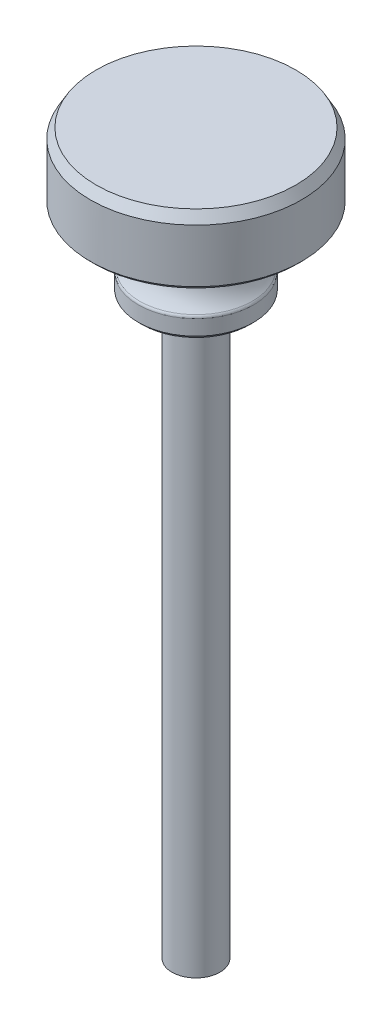
ISO-10303-21;
HEADER;
FILE_DESCRIPTION(('STEP AP214'),'2;1');
FILE_NAME('part.step','',(''),(''),'','','');
FILE_SCHEMA(('AUTOMOTIVE_DESIGN { 1 0 10303 214 1 1 1 1 }'));
ENDSEC;
DATA;
#1=APPLICATION_CONTEXT('core data for automotive mechanical design processes');
#2=APPLICATION_PROTOCOL_DEFINITION('international standard','automotive_design',2000,#1);
#3=PRODUCT_CONTEXT('',#1,'mechanical');
#4=PRODUCT('Part','Part','',(#3));
#5=PRODUCT_RELATED_PRODUCT_CATEGORY('part','',(#4));
#6=PRODUCT_DEFINITION_FORMATION('','',#4);
#7=PRODUCT_DEFINITION_CONTEXT('part definition',#1,'design');
#8=PRODUCT_DEFINITION('design','',#6,#7);
#9=PRODUCT_DEFINITION_SHAPE('','',#8);
#10=(LENGTH_UNIT() NAMED_UNIT(*) SI_UNIT(.MILLI.,.METRE.));
#11=(NAMED_UNIT(*) PLANE_ANGLE_UNIT() SI_UNIT($,.RADIAN.));
#12=(NAMED_UNIT(*) SI_UNIT($,.STERADIAN.) SOLID_ANGLE_UNIT());
#13=UNCERTAINTY_MEASURE_WITH_UNIT(LENGTH_MEASURE(1.E-05),#10,'distance_accuracy_value','');
#14=(GEOMETRIC_REPRESENTATION_CONTEXT(3) GLOBAL_UNCERTAINTY_ASSIGNED_CONTEXT((#13)) GLOBAL_UNIT_ASSIGNED_CONTEXT((#10,
#11,#12)) REPRESENTATION_CONTEXT('',''));
#15=CARTESIAN_POINT('',(0.,0.,0.));
#16=DIRECTION('',(0.,0.,1.));
#17=DIRECTION('',(1.,0.,0.));
#18=AXIS2_PLACEMENT_3D('',#15,#16,#17);
#19=CARTESIAN_POINT('',(0.,68.916509816989,0.));
#20=DIRECTION('',(0.,-1.,0.));
#21=DIRECTION('',(0.,0.,-1.));
#22=AXIS2_PLACEMENT_3D('',#19,#20,#21);
#23=PLANE('',#22);
#24=CARTESIAN_POINT('',(0.,68.916509816989,0.));
#25=DIRECTION('',(0.,-1.,0.));
#26=DIRECTION('',(0.,0.,-1.));
#27=AXIS2_PLACEMENT_3D('',#24,#25,#26);
#28=CIRCLE('',#27,1.25);
#29=CARTESIAN_POINT('',(0.,68.916509816989,-1.25));
#30=VERTEX_POINT('',#29);
#31=EDGE_CURVE('E81',#30,#30,#28,.T.);
#32=ORIENTED_EDGE('',*,*,#31,.T.);
#33=EDGE_LOOP('',(#32));
#34=FACE_BOUND('',#33,.T.);
#35=ADVANCED_FACE('F46',(#34),#23,.T.);
#36=CARTESIAN_POINT('',(0.,88.7878888527258,0.));
#37=DIRECTION('',(0.,-1.,0.));
#38=DIRECTION('',(0.,0.,-1.));
#39=AXIS2_PLACEMENT_3D('',#36,#37,#38);
#40=CYLINDRICAL_SURFACE('',#39,1.25);
#41=CARTESIAN_POINT('',(0.,98.916509816989,0.));
#42=DIRECTION('',(0.,-1.,0.));
#43=DIRECTION('',(0.,0.,-1.));
#44=AXIS2_PLACEMENT_3D('',#41,#42,#43);
#45=CIRCLE('',#44,1.25);
#46=CARTESIAN_POINT('',(0.,98.916509816989,-1.25));
#47=VERTEX_POINT('',#46);
#48=EDGE_CURVE('E87',#47,#47,#45,.T.);
#49=ORIENTED_EDGE('',*,*,#48,.T.);
#50=EDGE_LOOP('',(#49));
#51=FACE_BOUND('',#50,.T.);
#52=ORIENTED_EDGE('',*,*,#31,.F.);
#53=EDGE_LOOP('',(#52));
#54=FACE_BOUND('',#53,.T.);
#55=ADVANCED_FACE('F93',(#51,#54),#40,.T.);
#56=CARTESIAN_POINT('',(0.,101.454420986894,0.));
#57=DIRECTION('',(0.,-1.,0.));
#58=DIRECTION('',(0.,0.,-1.));
#59=AXIS2_PLACEMENT_3D('',#56,#57,#58);
#60=TOROIDAL_SURFACE('',#59,4.33666965305537,1.98100719546625);
#61=CARTESIAN_POINT('',(0.,102.858237355576,0.));
#62=DIRECTION('',(0.,-1.,0.));
#63=DIRECTION('',(0.,0.,-1.));
#64=AXIS2_PLACEMENT_3D('',#61,#62,#63);
#65=CIRCLE('',#64,2.93892535902002);
#66=CARTESIAN_POINT('',(0.,102.858237355576,-2.93892535902002));
#67=VERTEX_POINT('',#66);
#68=EDGE_CURVE('E52',#67,#67,#65,.T.);
#69=ORIENTED_EDGE('',*,*,#68,.T.);
#70=EDGE_LOOP('',(#69));
#71=FACE_BOUND('',#70,.T.);
#72=CARTESIAN_POINT('',(0.,100.048627615408,0.));
#73=DIRECTION('',(0.,1.,0.));
#74=DIRECTION('',(0.,0.,1.));
#75=AXIS2_PLACEMENT_3D('',#72,#73,#74);
#76=CIRCLE('',#75,2.94091376280186);
#77=CARTESIAN_POINT('',(0.,100.048627615408,2.94091376280185));
#78=VERTEX_POINT('',#77);
#79=EDGE_CURVE('E60',#78,#78,#76,.T.);
#80=ORIENTED_EDGE('',*,*,#79,.T.);
#81=EDGE_LOOP('',(#80));
#82=FACE_BOUND('',#81,.T.);
#83=ADVANCED_FACE('F117',(#71,#82),#60,.F.);
#84=CARTESIAN_POINT('',(0.,102.916509816989,0.));
#85=DIRECTION('',(0.,-1.,0.));
#86=DIRECTION('',(0.,0.,-1.));
#87=AXIS2_PLACEMENT_3D('',#84,#85,#86);
#88=PLANE('',#87);
#89=CARTESIAN_POINT('',(0.,102.916509816989,0.));
#90=DIRECTION('',(0.,-1.,0.));
#91=DIRECTION('',(0.,0.,-1.));
#92=AXIS2_PLACEMENT_3D('',#89,#90,#91);
#93=CIRCLE('',#92,3.08003986857195);
#94=CARTESIAN_POINT('',(0.,102.916509816989,-3.08003986857195));
#95=VERTEX_POINT('',#94);
#96=EDGE_CURVE('E11',#95,#95,#93,.F.);
#97=ORIENTED_EDGE('',*,*,#96,.T.);
#98=EDGE_LOOP('',(#97));
#99=FACE_BOUND('',#98,.T.);
#100=CARTESIAN_POINT('',(0.,102.916509816989,0.));
#101=DIRECTION('',(0.,-1.,0.));
#102=DIRECTION('',(0.,0.,-1.));
#103=AXIS2_PLACEMENT_3D('',#100,#101,#102);
#104=CIRCLE('',#103,5.30000000000001);
#105=CARTESIAN_POINT('',(0.,102.916509816989,-5.30000000000001));
#106=VERTEX_POINT('',#105);
#107=EDGE_CURVE('E73',#106,#106,#104,.T.);
#108=ORIENTED_EDGE('',*,*,#107,.T.);
#109=EDGE_LOOP('',(#108));
#110=FACE_BOUND('',#109,.T.);
#111=ADVANCED_FACE('F148',(#99,#110),#88,.T.);
#112=CARTESIAN_POINT('',(0.,88.7878888527258,0.));
#113=DIRECTION('',(0.,-1.,0.));
#114=DIRECTION('',(0.,0.,-1.));
#115=AXIS2_PLACEMENT_3D('',#112,#113,#114);
#116=CYLINDRICAL_SURFACE('',#115,5.5);
#117=CARTESIAN_POINT('',(0.,103.116509816989,0.));
#118=DIRECTION('',(0.,-1.,0.));
#119=DIRECTION('',(0.,0.,-1.));
#120=AXIS2_PLACEMENT_3D('',#117,#118,#119);
#121=CIRCLE('',#120,5.5);
#122=CARTESIAN_POINT('',(0.,103.116509816989,-5.50000000000001));
#123=VERTEX_POINT('',#122);
#124=EDGE_CURVE('E75',#123,#123,#121,.F.);
#125=ORIENTED_EDGE('',*,*,#124,.T.);
#126=EDGE_LOOP('',(#125));
#127=FACE_BOUND('',#126,.T.);
#128=CARTESIAN_POINT('',(0.,105.896894574718,0.));
#129=DIRECTION('',(0.,1.,0.));
#130=DIRECTION('',(0.,0.,1.));
#131=AXIS2_PLACEMENT_3D('',#128,#129,#130);
#132=CIRCLE('',#131,5.5);
#133=CARTESIAN_POINT('',(0.,105.896894574718,5.5));
#134=VERTEX_POINT('',#133);
#135=EDGE_CURVE('E82',#134,#134,#132,.F.);
#136=ORIENTED_EDGE('',*,*,#135,.T.);
#137=EDGE_LOOP('',(#136));
#138=FACE_BOUND('',#137,.T.);
#139=ADVANCED_FACE('F110',(#127,#138),#116,.T.);
#140=CARTESIAN_POINT('',(0.,106.416509816989,0.));
#141=DIRECTION('',(0.,1.,0.));
#142=DIRECTION('',(0.,0.,1.));
#143=AXIS2_PLACEMENT_3D('',#140,#141,#142);
#144=PLANE('',#143);
#145=CARTESIAN_POINT('',(0.,106.416509816989,0.));
#146=DIRECTION('',(0.,1.,0.));
#147=DIRECTION('',(0.,0.,1.));
#148=AXIS2_PLACEMENT_3D('',#145,#146,#147);
#149=CIRCLE('',#148,5.2);
#150=CARTESIAN_POINT('',(0.,106.416509816989,5.2));
#151=VERTEX_POINT('',#150);
#152=EDGE_CURVE('E80',#151,#151,#149,.T.);
#153=ORIENTED_EDGE('',*,*,#152,.T.);
#154=EDGE_LOOP('',(#153));
#155=FACE_BOUND('',#154,.T.);
#156=ADVANCED_FACE('F100',(#155),#144,.T.);
#157=CARTESIAN_POINT('',(0.,98.916509816989,0.));
#158=DIRECTION('',(0.,1.,0.));
#159=DIRECTION('',(0.,0.,1.));
#160=AXIS2_PLACEMENT_3D('',#157,#158,#159);
#161=PLANE('',#160);
#162=CARTESIAN_POINT('',(0.,98.916509816989,0.));
#163=DIRECTION('',(0.,1.,0.));
#164=DIRECTION('',(0.,0.,1.));
#165=AXIS2_PLACEMENT_3D('',#162,#163,#164);
#166=CIRCLE('',#165,2.8);
#167=CARTESIAN_POINT('',(0.,98.916509816989,2.79999999999999));
#168=VERTEX_POINT('',#167);
#169=EDGE_CURVE('E66',#168,#168,#166,.F.);
#170=ORIENTED_EDGE('',*,*,#169,.T.);
#171=EDGE_LOOP('',(#170));
#172=FACE_BOUND('',#171,.T.);
#173=ORIENTED_EDGE('',*,*,#48,.F.);
#174=EDGE_LOOP('',(#173));
#175=FACE_BOUND('',#174,.T.);
#176=ADVANCED_FACE('F94',(#172,#175),#161,.F.);
#177=CARTESIAN_POINT('',(0.,88.7878888527258,0.));
#178=DIRECTION('',(0.,-1.,0.));
#179=DIRECTION('',(0.,0.,-1.));
#180=AXIS2_PLACEMENT_3D('',#177,#178,#179);
#181=CYLINDRICAL_SURFACE('',#180,3.);
#182=CARTESIAN_POINT('',(0.,99.9067004810998,0.));
#183=DIRECTION('',(0.,1.,0.));
#184=DIRECTION('',(0.,0.,1.));
#185=AXIS2_PLACEMENT_3D('',#182,#183,#184);
#186=CIRCLE('',#185,3.);
#187=CARTESIAN_POINT('',(0.,99.9067004810998,3.));
#188=VERTEX_POINT('',#187);
#189=EDGE_CURVE('E62',#188,#188,#186,.F.);
#190=ORIENTED_EDGE('',*,*,#189,.T.);
#191=EDGE_LOOP('',(#190));
#192=FACE_BOUND('',#191,.T.);
#193=CARTESIAN_POINT('',(0.,99.116509816989,0.));
#194=DIRECTION('',(0.,1.,0.));
#195=DIRECTION('',(0.,0.,1.));
#196=AXIS2_PLACEMENT_3D('',#193,#194,#195);
#197=CIRCLE('',#196,3.);
#198=CARTESIAN_POINT('',(0.,99.116509816989,3.));
#199=VERTEX_POINT('',#198);
#200=EDGE_CURVE('E67',#199,#199,#197,.T.);
#201=ORIENTED_EDGE('',*,*,#200,.T.);
#202=EDGE_LOOP('',(#201));
#203=FACE_BOUND('',#202,.T.);
#204=ADVANCED_FACE('F96',(#192,#203),#181,.T.);
#205=CARTESIAN_POINT('',(0.,105.896894574718,0.));
#206=DIRECTION('',(0.,-1.,0.));
#207=DIRECTION('',(0.,0.,-1.));
#208=AXIS2_PLACEMENT_3D('',#205,#206,#207);
#209=CONICAL_SURFACE('',#208,5.5,0.523598775598295);
#210=ORIENTED_EDGE('',*,*,#152,.F.);
#211=EDGE_LOOP('',(#210));
#212=FACE_BOUND('',#211,.T.);
#213=ORIENTED_EDGE('',*,*,#135,.F.);
#214=EDGE_LOOP('',(#213));
#215=FACE_BOUND('',#214,.T.);
#216=ADVANCED_FACE('F102',(#212,#215),#209,.T.);
#217=CARTESIAN_POINT('',(0.,102.916509816989,0.));
#218=DIRECTION('',(0.,1.,0.));
#219=DIRECTION('',(0.,0.,1.));
#220=AXIS2_PLACEMENT_3D('',#217,#218,#219);
#221=CONICAL_SURFACE('',#220,5.30000000000001,0.785398163397438);
#222=ORIENTED_EDGE('',*,*,#124,.F.);
#223=EDGE_LOOP('',(#222));
#224=FACE_BOUND('',#223,.T.);
#225=ORIENTED_EDGE('',*,*,#107,.F.);
#226=EDGE_LOOP('',(#225));
#227=FACE_BOUND('',#226,.T.);
#228=ADVANCED_FACE('F124',(#224,#227),#221,.T.);
#229=CARTESIAN_POINT('',(0.,98.916509816989,0.));
#230=DIRECTION('',(0.,1.,0.));
#231=DIRECTION('',(0.,0.,1.));
#232=AXIS2_PLACEMENT_3D('',#229,#230,#231);
#233=CONICAL_SURFACE('',#232,2.8,0.785398163397449);
#234=ORIENTED_EDGE('',*,*,#200,.F.);
#235=EDGE_LOOP('',(#234));
#236=FACE_BOUND('',#235,.T.);
#237=ORIENTED_EDGE('',*,*,#169,.F.);
#238=EDGE_LOOP('',(#237));
#239=FACE_BOUND('',#238,.T.);
#240=ADVANCED_FACE('F127',(#236,#239),#233,.T.);
#241=CARTESIAN_POINT('',(0.,99.9067004810998,0.));
#242=DIRECTION('',(0.,1.,0.));
#243=DIRECTION('',(0.,0.,1.));
#244=AXIS2_PLACEMENT_3D('',#241,#242,#243);
#245=TOROIDAL_SURFACE('',#244,2.8,0.2);
#246=ORIENTED_EDGE('',*,*,#79,.F.);
#247=EDGE_LOOP('',(#246));
#248=FACE_BOUND('',#247,.T.);
#249=ORIENTED_EDGE('',*,*,#189,.F.);
#250=EDGE_LOOP('',(#249));
#251=FACE_BOUND('',#250,.T.);
#252=ADVANCED_FACE('F129',(#248,#251),#245,.T.);
#253=CARTESIAN_POINT('',(0.,102.716509816989,0.));
#254=DIRECTION('',(0.,1.,0.));
#255=DIRECTION('',(0.,0.,1.));
#256=AXIS2_PLACEMENT_3D('',#253,#254,#255);
#257=TOROIDAL_SURFACE('',#256,3.08003986857195,0.2);
#258=ORIENTED_EDGE('',*,*,#96,.F.);
#259=EDGE_LOOP('',(#258));
#260=FACE_BOUND('',#259,.T.);
#261=ORIENTED_EDGE('',*,*,#68,.F.);
#262=EDGE_LOOP('',(#261));
#263=FACE_BOUND('',#262,.T.);
#264=ADVANCED_FACE('F48',(#260,#263),#257,.F.);
#265=CLOSED_SHELL('',(#35,#55,#83,#111,#139,#156,#176,#204,#216,#228,#240,#252,#264));
#266=MANIFOLD_SOLID_BREP('B2',#265);
#267=ADVANCED_BREP_SHAPE_REPRESENTATION('',(#18,#266),#14);
#268=SHAPE_DEFINITION_REPRESENTATION(#9,#267);
ENDSEC;
END-ISO-10303-21;
